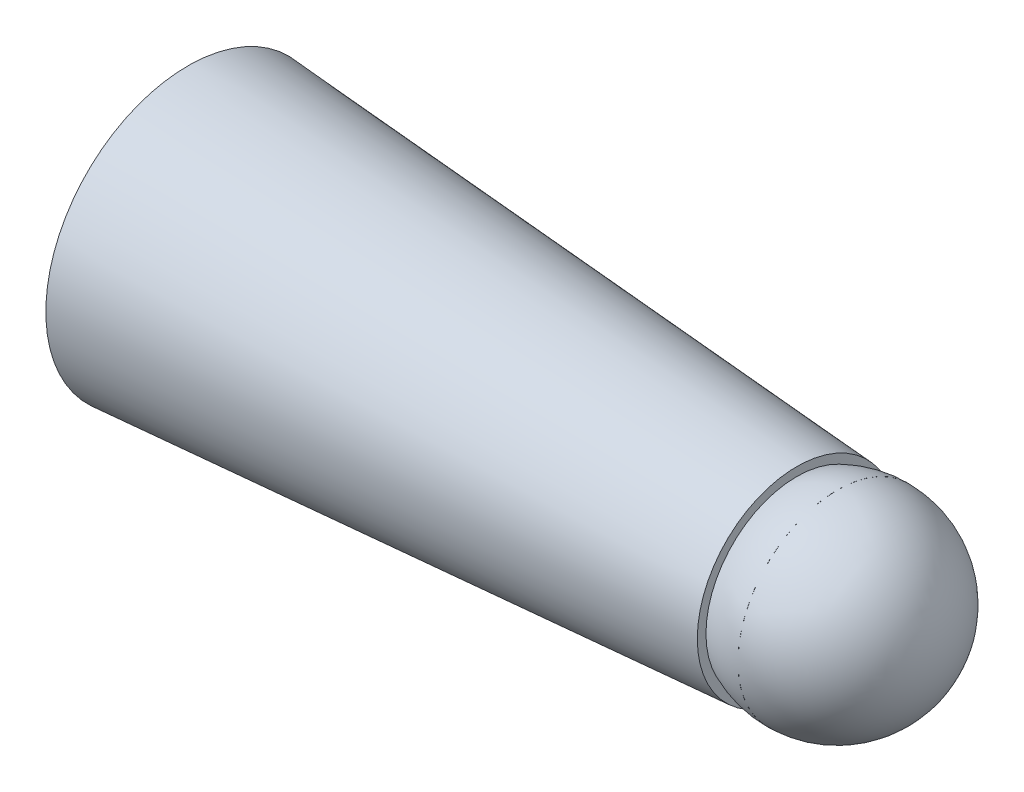
ISO-10303-21;
HEADER;
FILE_DESCRIPTION(('STEP AP214'),'2;1');
FILE_NAME('part.step','',(''),(''),'','','');
FILE_SCHEMA(('AUTOMOTIVE_DESIGN { 1 0 10303 214 1 1 1 1 }'));
ENDSEC;
DATA;
#1=APPLICATION_CONTEXT('core data for automotive mechanical design processes');
#2=APPLICATION_PROTOCOL_DEFINITION('international standard','automotive_design',2000,#1);
#3=PRODUCT_CONTEXT('',#1,'mechanical');
#4=PRODUCT('Part','Part','',(#3));
#5=PRODUCT_RELATED_PRODUCT_CATEGORY('part','',(#4));
#6=PRODUCT_DEFINITION_FORMATION('','',#4);
#7=PRODUCT_DEFINITION_CONTEXT('part definition',#1,'design');
#8=PRODUCT_DEFINITION('design','',#6,#7);
#9=PRODUCT_DEFINITION_SHAPE('','',#8);
#10=(LENGTH_UNIT() NAMED_UNIT(*) SI_UNIT(.MILLI.,.METRE.));
#11=(NAMED_UNIT(*) PLANE_ANGLE_UNIT() SI_UNIT($,.RADIAN.));
#12=(NAMED_UNIT(*) SI_UNIT($,.STERADIAN.) SOLID_ANGLE_UNIT());
#13=UNCERTAINTY_MEASURE_WITH_UNIT(LENGTH_MEASURE(1.E-05),#10,'distance_accuracy_value','');
#14=(GEOMETRIC_REPRESENTATION_CONTEXT(3) GLOBAL_UNCERTAINTY_ASSIGNED_CONTEXT((#13)) GLOBAL_UNIT_ASSIGNED_CONTEXT((#10,
#11,#12)) REPRESENTATION_CONTEXT('',''));
#15=CARTESIAN_POINT('',(0.,0.,0.));
#16=DIRECTION('',(0.,0.,1.));
#17=DIRECTION('',(1.,0.,0.));
#18=AXIS2_PLACEMENT_3D('',#15,#16,#17);
#19=CARTESIAN_POINT('',(16.,0.,0.));
#20=DIRECTION('',(1.,0.,0.));
#21=DIRECTION('',(0.,0.,-1.));
#22=AXIS2_PLACEMENT_3D('',#19,#20,#21);
#23=PLANE('',#22);
#24=CARTESIAN_POINT('',(16.,0.,0.));
#25=DIRECTION('',(1.,0.,0.));
#26=DIRECTION('',(0.,0.,-1.));
#27=AXIS2_PLACEMENT_3D('',#24,#25,#26);
#28=CIRCLE('',#27,2.45109782084734);
#29=CARTESIAN_POINT('',(16.,0.,-2.45109782084734));
#30=VERTEX_POINT('',#29);
#31=EDGE_CURVE('E11',#30,#30,#28,.T.);
#32=ORIENTED_EDGE('',*,*,#31,.T.);
#33=EDGE_LOOP('',(#32));
#34=FACE_BOUND('',#33,.T.);
#35=ADVANCED_FACE('F40',(#34),#23,.T.);
#36=OPEN_SHELL('',(#35));
#37=SHELL_BASED_SURFACE_MODEL('B2',(#36));
#38=CARTESIAN_POINT('',(15.,0.,0.));
#39=DIRECTION('',(1.,0.,0.));
#40=DIRECTION('',(0.,0.,-1.));
#41=AXIS2_PLACEMENT_3D('',#38,#39,#40);
#42=PLANE('',#41);
#43=CARTESIAN_POINT('',(15.,0.,0.));
#44=DIRECTION('',(1.,0.,0.));
#45=DIRECTION('',(0.,0.,-1.));
#46=AXIS2_PLACEMENT_3D('',#43,#44,#45);
#47=CIRCLE('',#46,2.45109782084734);
#48=CARTESIAN_POINT('',(15.,0.,-2.45109782084734));
#49=VERTEX_POINT('',#48);
#50=EDGE_CURVE('E39',#49,#49,#47,.T.);
#51=ORIENTED_EDGE('',*,*,#50,.T.);
#52=EDGE_LOOP('',(#51));
#53=FACE_BOUND('',#52,.T.);
#54=CARTESIAN_POINT('',(15.,0.,0.));
#55=DIRECTION('',(1.,0.,0.));
#56=DIRECTION('',(0.,0.,-1.));
#57=AXIS2_PLACEMENT_3D('',#54,#55,#56);
#58=CIRCLE('',#57,2.23782942320513);
#59=CARTESIAN_POINT('',(15.,0.,-2.23782942320513));
#60=VERTEX_POINT('',#59);
#61=EDGE_CURVE('E60',#60,#60,#58,.F.);
#62=ORIENTED_EDGE('',*,*,#61,.T.);
#63=EDGE_LOOP('',(#62));
#64=FACE_BOUND('',#63,.T.);
#65=ADVANCED_FACE('F56',(#53,#64),#42,.T.);
#66=CARTESIAN_POINT('',(0.,0.,0.));
#67=DIRECTION('',(-1.,0.,0.));
#68=DIRECTION('',(0.,0.,-1.));
#69=AXIS2_PLACEMENT_3D('',#66,#67,#68);
#70=CONICAL_SURFACE('',#69,3.5,0.0698131700797732);
#71=ORIENTED_EDGE('',*,*,#50,.F.);
#72=EDGE_LOOP('',(#71));
#73=FACE_BOUND('',#72,.T.);
#74=CARTESIAN_POINT('',(0.,0.,0.));
#75=DIRECTION('',(1.,0.,0.));
#76=DIRECTION('',(0.,0.,-1.));
#77=AXIS2_PLACEMENT_3D('',#74,#75,#76);
#78=CIRCLE('',#77,3.5);
#79=CARTESIAN_POINT('',(0.,0.,-3.5));
#80=VERTEX_POINT('',#79);
#81=EDGE_CURVE('E64',#80,#80,#78,.T.);
#82=ORIENTED_EDGE('',*,*,#81,.T.);
#83=EDGE_LOOP('',(#82));
#84=FACE_BOUND('',#83,.T.);
#85=ADVANCED_FACE('F58',(#73,#84),#70,.T.);
#86=CARTESIAN_POINT('',(0.,0.,0.));
#87=DIRECTION('',(1.,0.,0.));
#88=DIRECTION('',(0.,0.,-1.));
#89=AXIS2_PLACEMENT_3D('',#86,#87,#88);
#90=PLANE('',#89);
#91=ORIENTED_EDGE('',*,*,#81,.F.);
#92=EDGE_LOOP('',(#91));
#93=FACE_BOUND('',#92,.T.);
#94=ADVANCED_FACE('F77',(#93),#90,.F.);
#95=CARTESIAN_POINT('',(16.,0.,0.));
#96=DIRECTION('',(0.,1.,0.));
#97=DIRECTION('',(0.,0.,-1.));
#98=AXIS2_PLACEMENT_3D('',#95,#96,#97);
#99=SPHERICAL_SURFACE('',#98,2.45109782084734);
#100=CARTESIAN_POINT('',(16.,0.,0.));
#101=DIRECTION('',(1.,0.,0.));
#102=DIRECTION('',(0.,0.,-1.));
#103=AXIS2_PLACEMENT_3D('',#100,#101,#102);
#104=SPHERICAL_SURFACE('',#103,2.45109782084734);
#105=ORIENTED_EDGE('',*,*,#61,.F.);
#106=EDGE_LOOP('',(#105));
#107=FACE_BOUND('',#106,.T.);
#108=ADVANCED_FACE('F75',(#107),#104,.T.);
#109=CLOSED_SHELL('',(#65,#85,#94,#108));
#110=MANIFOLD_SOLID_BREP('B6',#109);
#111=ADVANCED_BREP_SHAPE_REPRESENTATION('',(#18,#110),#14);
#112=MANIFOLD_SURFACE_SHAPE_REPRESENTATION('',(#18,#37),#14);
#113=SHAPE_REPRESENTATION('',(#18),#14);
#114=SHAPE_DEFINITION_REPRESENTATION(#9,#113);
#115=SHAPE_REPRESENTATION_RELATIONSHIP('','',#113,#111);
#116=SHAPE_REPRESENTATION_RELATIONSHIP('','',#113,#112);
ENDSEC;
END-ISO-10303-21;
